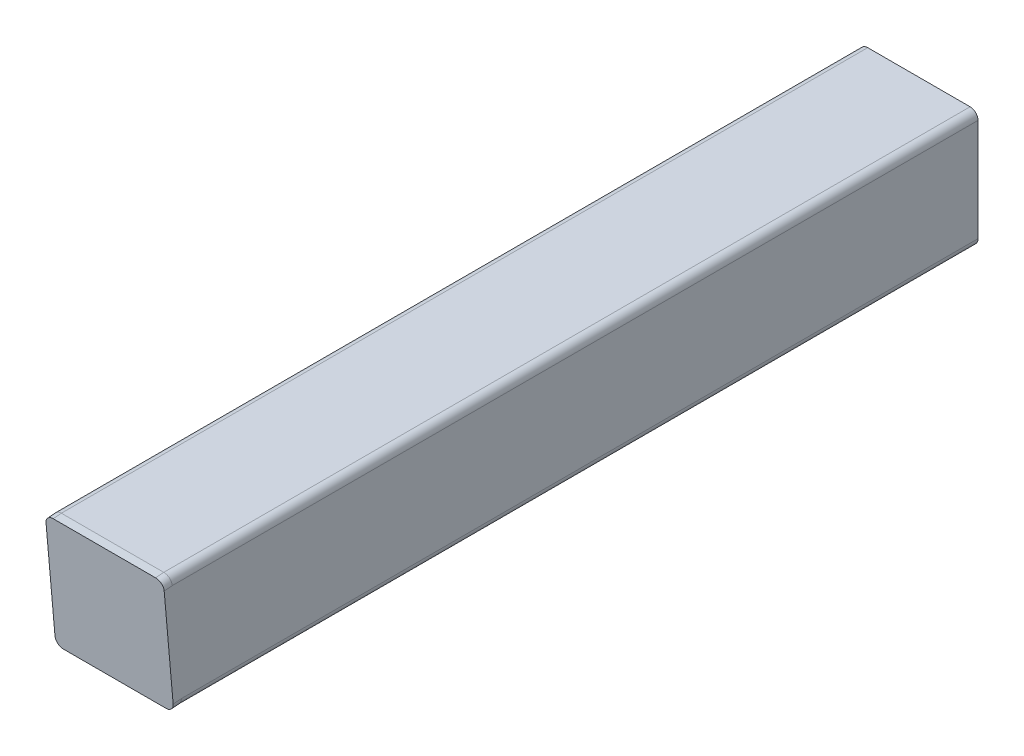
ISO-10303-21;
HEADER;
FILE_DESCRIPTION(('STEP AP214'),'2;1');
FILE_NAME('part.step','',(''),(''),'','','');
FILE_SCHEMA(('AUTOMOTIVE_DESIGN { 1 0 10303 214 1 1 1 1 }'));
ENDSEC;
DATA;
#1=APPLICATION_CONTEXT('core data for automotive mechanical design processes');
#2=APPLICATION_PROTOCOL_DEFINITION('international standard','automotive_design',2000,#1);
#3=PRODUCT_CONTEXT('',#1,'mechanical');
#4=PRODUCT('Part','Part','',(#3));
#5=PRODUCT_RELATED_PRODUCT_CATEGORY('part','',(#4));
#6=PRODUCT_DEFINITION_FORMATION('','',#4);
#7=PRODUCT_DEFINITION_CONTEXT('part definition',#1,'design');
#8=PRODUCT_DEFINITION('design','',#6,#7);
#9=PRODUCT_DEFINITION_SHAPE('','',#8);
#10=(LENGTH_UNIT() NAMED_UNIT(*) SI_UNIT(.MILLI.,.METRE.));
#11=(NAMED_UNIT(*) PLANE_ANGLE_UNIT() SI_UNIT($,.RADIAN.));
#12=(NAMED_UNIT(*) SI_UNIT($,.STERADIAN.) SOLID_ANGLE_UNIT());
#13=UNCERTAINTY_MEASURE_WITH_UNIT(LENGTH_MEASURE(1.E-05),#10,'distance_accuracy_value','');
#14=(GEOMETRIC_REPRESENTATION_CONTEXT(3) GLOBAL_UNCERTAINTY_ASSIGNED_CONTEXT((#13)) GLOBAL_UNIT_ASSIGNED_CONTEXT((#10,
#11,#12)) REPRESENTATION_CONTEXT('',''));
#15=CARTESIAN_POINT('',(0.,0.,0.));
#16=DIRECTION('',(0.,0.,1.));
#17=DIRECTION('',(1.,0.,0.));
#18=AXIS2_PLACEMENT_3D('',#15,#16,#17);
#19=CARTESIAN_POINT('',(2.54,-35.56,0.));
#20=DIRECTION('',(0.,0.,1.));
#21=DIRECTION('',(1.,0.,0.));
#22=AXIS2_PLACEMENT_3D('',#19,#20,#21);
#23=PLANE('',#22);
#24=CARTESIAN_POINT('',(2.54,-35.56,0.));
#25=DIRECTION('',(0.,0.,1.));
#26=DIRECTION('',(1.,0.,0.));
#27=AXIS2_PLACEMENT_3D('',#24,#25,#26);
#28=CIRCLE('',#27,2.54);
#29=CARTESIAN_POINT('',(0.,-35.56,0.));
#30=VERTEX_POINT('',#29);
#31=CARTESIAN_POINT('',(2.54000000000002,-38.1,0.));
#32=VERTEX_POINT('',#31);
#33=EDGE_CURVE('E358',#30,#32,#28,.T.);
#34=ORIENTED_EDGE('',*,*,#33,.F.);
#35=DIRECTION('',(0.,-1.,0.));
#36=VECTOR('',#35,1.);
#37=CARTESIAN_POINT('',(0.,-2.54000000000002,0.));
#38=LINE('',#37,#36);
#39=CARTESIAN_POINT('',(0.,-2.54000000000002,0.));
#40=VERTEX_POINT('',#39);
#41=EDGE_CURVE('E342',#40,#30,#38,.T.);
#42=ORIENTED_EDGE('',*,*,#41,.F.);
#43=CARTESIAN_POINT('',(2.54,-2.54,0.));
#44=DIRECTION('',(0.,0.,1.));
#45=DIRECTION('',(-1.,0.,0.));
#46=AXIS2_PLACEMENT_3D('',#43,#44,#45);
#47=CIRCLE('',#46,2.54);
#48=CARTESIAN_POINT('',(2.54000000000002,0.,0.));
#49=VERTEX_POINT('',#48);
#50=EDGE_CURVE('E345',#49,#40,#47,.T.);
#51=ORIENTED_EDGE('',*,*,#50,.F.);
#52=DIRECTION('',(-1.,0.,0.));
#53=VECTOR('',#52,1.);
#54=CARTESIAN_POINT('',(2.54000000000002,0.,0.));
#55=LINE('',#54,#53);
#56=CARTESIAN_POINT('',(35.56,0.,0.));
#57=VERTEX_POINT('',#56);
#58=EDGE_CURVE('E348',#57,#49,#55,.T.);
#59=ORIENTED_EDGE('',*,*,#58,.F.);
#60=CARTESIAN_POINT('',(35.56,-2.54,0.));
#61=DIRECTION('',(0.,0.,1.));
#62=DIRECTION('',(1.,0.,0.));
#63=AXIS2_PLACEMENT_3D('',#60,#61,#62);
#64=CIRCLE('',#63,2.54);
#65=CARTESIAN_POINT('',(38.1,-2.54000000000002,0.));
#66=VERTEX_POINT('',#65);
#67=EDGE_CURVE('E350',#66,#57,#64,.T.);
#68=ORIENTED_EDGE('',*,*,#67,.F.);
#69=DIRECTION('',(0.,1.,0.));
#70=VECTOR('',#69,1.);
#71=CARTESIAN_POINT('',(38.1,-2.54000000000002,0.));
#72=LINE('',#71,#70);
#73=CARTESIAN_POINT('',(38.1,-35.56,0.));
#74=VERTEX_POINT('',#73);
#75=EDGE_CURVE('E352',#74,#66,#72,.T.);
#76=ORIENTED_EDGE('',*,*,#75,.F.);
#77=CARTESIAN_POINT('',(35.56,-35.56,0.));
#78=DIRECTION('',(0.,0.,1.));
#79=DIRECTION('',(-1.,0.,0.));
#80=AXIS2_PLACEMENT_3D('',#77,#78,#79);
#81=CIRCLE('',#80,2.54);
#82=CARTESIAN_POINT('',(35.56,-38.1,0.));
#83=VERTEX_POINT('',#82);
#84=EDGE_CURVE('E355',#83,#74,#81,.T.);
#85=ORIENTED_EDGE('',*,*,#84,.F.);
#86=DIRECTION('',(1.,0.,0.));
#87=VECTOR('',#86,1.);
#88=CARTESIAN_POINT('',(2.54000000000002,-38.1,0.));
#89=LINE('',#88,#87);
#90=EDGE_CURVE('E321',#32,#83,#89,.T.);
#91=ORIENTED_EDGE('',*,*,#90,.F.);
#92=EDGE_LOOP('',(#34,#42,#51,#59,#68,#76,#85,#91));
#93=FACE_BOUND('',#92,.T.);
#94=CARTESIAN_POINT('',(5.3086,-32.7914,0.));
#95=DIRECTION('',(0.,0.,1.));
#96=DIRECTION('',(1.,0.,0.));
#97=AXIS2_PLACEMENT_3D('',#94,#95,#96);
#98=CIRCLE('',#97,2.54);
#99=CARTESIAN_POINT('',(2.7686,-32.7914,0.));
#100=VERTEX_POINT('',#99);
#101=CARTESIAN_POINT('',(5.30860000000002,-35.3314,0.));
#102=VERTEX_POINT('',#101);
#103=EDGE_CURVE('E400',#100,#102,#98,.T.);
#104=ORIENTED_EDGE('',*,*,#103,.T.);
#105=DIRECTION('',(1.,0.,0.));
#106=VECTOR('',#105,1.);
#107=CARTESIAN_POINT('',(5.30860000000002,-35.3314,0.));
#108=LINE('',#107,#106);
#109=CARTESIAN_POINT('',(32.7914,-35.3314,0.));
#110=VERTEX_POINT('',#109);
#111=EDGE_CURVE('E397',#102,#110,#108,.T.);
#112=ORIENTED_EDGE('',*,*,#111,.T.);
#113=CARTESIAN_POINT('',(32.7914,-32.7914,0.));
#114=DIRECTION('',(0.,0.,1.));
#115=DIRECTION('',(1.,0.,0.));
#116=AXIS2_PLACEMENT_3D('',#113,#114,#115);
#117=CIRCLE('',#116,2.54);
#118=CARTESIAN_POINT('',(35.3314,-32.7914,0.));
#119=VERTEX_POINT('',#118);
#120=EDGE_CURVE('E394',#110,#119,#117,.T.);
#121=ORIENTED_EDGE('',*,*,#120,.T.);
#122=DIRECTION('',(0.,1.,0.));
#123=VECTOR('',#122,1.);
#124=CARTESIAN_POINT('',(35.3314,-5.30860000000002,0.));
#125=LINE('',#124,#123);
#126=CARTESIAN_POINT('',(35.3314,-5.30860000000002,0.));
#127=VERTEX_POINT('',#126);
#128=EDGE_CURVE('E391',#119,#127,#125,.T.);
#129=ORIENTED_EDGE('',*,*,#128,.T.);
#130=CARTESIAN_POINT('',(32.7914,-5.3086,0.));
#131=DIRECTION('',(0.,0.,1.));
#132=DIRECTION('',(1.,0.,0.));
#133=AXIS2_PLACEMENT_3D('',#130,#131,#132);
#134=CIRCLE('',#133,2.54);
#135=CARTESIAN_POINT('',(32.7914,-2.7686,0.));
#136=VERTEX_POINT('',#135);
#137=EDGE_CURVE('E388',#127,#136,#134,.T.);
#138=ORIENTED_EDGE('',*,*,#137,.T.);
#139=DIRECTION('',(-1.,0.,0.));
#140=VECTOR('',#139,1.);
#141=CARTESIAN_POINT('',(5.30860000000002,-2.7686,0.));
#142=LINE('',#141,#140);
#143=CARTESIAN_POINT('',(5.30860000000002,-2.7686,0.));
#144=VERTEX_POINT('',#143);
#145=EDGE_CURVE('E385',#136,#144,#142,.T.);
#146=ORIENTED_EDGE('',*,*,#145,.T.);
#147=CARTESIAN_POINT('',(5.3086,-5.3086,0.));
#148=DIRECTION('',(0.,0.,1.));
#149=DIRECTION('',(1.,0.,0.));
#150=AXIS2_PLACEMENT_3D('',#147,#148,#149);
#151=CIRCLE('',#150,2.54);
#152=CARTESIAN_POINT('',(2.7686,-5.30860000000002,0.));
#153=VERTEX_POINT('',#152);
#154=EDGE_CURVE('E382',#144,#153,#151,.T.);
#155=ORIENTED_EDGE('',*,*,#154,.T.);
#156=DIRECTION('',(0.,-1.,0.));
#157=VECTOR('',#156,1.);
#158=CARTESIAN_POINT('',(2.7686,-5.30860000000002,0.));
#159=LINE('',#158,#157);
#160=EDGE_CURVE('E379',#153,#100,#159,.T.);
#161=ORIENTED_EDGE('',*,*,#160,.T.);
#162=EDGE_LOOP('',(#104,#112,#121,#129,#138,#146,#155,#161));
#163=FACE_BOUND('',#162,.T.);
#164=ADVANCED_FACE('F33',(#93,#163),#23,.F.);
#165=CARTESIAN_POINT('',(2.54,-35.56,260.));
#166=DIRECTION('',(0.,0.,-1.));
#167=DIRECTION('',(-1.,0.,0.));
#168=AXIS2_PLACEMENT_3D('',#165,#166,#167);
#169=CYLINDRICAL_SURFACE('',#168,2.54);
#170=DIRECTION('',(0.,0.,-1.));
#171=VECTOR('',#170,1.);
#172=CARTESIAN_POINT('',(2.54000000000002,-38.1,260.));
#173=LINE('',#172,#171);
#174=CARTESIAN_POINT('',(2.54000000000002,-38.1,256.666681919662));
#175=VERTEX_POINT('',#174);
#176=EDGE_CURVE('E41',#175,#32,#173,.T.);
#177=ORIENTED_EDGE('',*,*,#176,.F.);
#178=CARTESIAN_POINT('',(2.54,-35.56,256.888903125018));
#179=DIRECTION('',(0.,0.0871557427476583,-0.996194698091746));
#180=DIRECTION('',(0.,-0.996194698091746,-0.0871557427476583));
#181=AXIS2_PLACEMENT_3D('',#178,#179,#180);
#182=ELLIPSE('',#181,2.5497023873601,2.54);
#183=CARTESIAN_POINT('',(0.,-35.56,256.888903125018));
#184=VERTEX_POINT('',#183);
#185=EDGE_CURVE('E403',#175,#184,#182,.T.);
#186=ORIENTED_EDGE('',*,*,#185,.T.);
#187=DIRECTION('',(0.,0.,-1.));
#188=VECTOR('',#187,1.);
#189=CARTESIAN_POINT('',(0.,-35.56,260.));
#190=LINE('',#189,#188);
#191=EDGE_CURVE('E339',#184,#30,#190,.T.);
#192=ORIENTED_EDGE('',*,*,#191,.T.);
#193=ORIENTED_EDGE('',*,*,#33,.T.);
#194=EDGE_LOOP('',(#177,#186,#192,#193));
#195=FACE_BOUND('',#194,.T.);
#196=ADVANCED_FACE('F35',(#195),#169,.T.);
#197=CARTESIAN_POINT('',(2.54000000000002,-38.1,260.));
#198=DIRECTION('',(0.,1.,0.));
#199=DIRECTION('',(0.,0.,1.));
#200=AXIS2_PLACEMENT_3D('',#197,#198,#199);
#201=PLANE('',#200);
#202=DIRECTION('',(0.,0.,-1.));
#203=VECTOR('',#202,1.);
#204=CARTESIAN_POINT('',(35.56,-38.1,260.));
#205=LINE('',#204,#203);
#206=CARTESIAN_POINT('',(35.56,-38.1,256.666681919662));
#207=VERTEX_POINT('',#206);
#208=EDGE_CURVE('E318',#207,#83,#205,.T.);
#209=ORIENTED_EDGE('',*,*,#208,.F.);
#210=DIRECTION('',(1.,0.,0.));
#211=VECTOR('',#210,1.);
#212=CARTESIAN_POINT('',(0.,-38.1,256.666681919662));
#213=LINE('',#212,#211);
#214=EDGE_CURVE('E189',#175,#207,#213,.T.);
#215=ORIENTED_EDGE('',*,*,#214,.F.);
#216=ORIENTED_EDGE('',*,*,#176,.T.);
#217=ORIENTED_EDGE('',*,*,#90,.T.);
#218=EDGE_LOOP('',(#209,#215,#216,#217));
#219=FACE_BOUND('',#218,.T.);
#220=ADVANCED_FACE('F307',(#219),#201,.F.);
#221=CARTESIAN_POINT('',(35.56,-35.56,260.));
#222=DIRECTION('',(0.,0.,-1.));
#223=DIRECTION('',(-1.,0.,0.));
#224=AXIS2_PLACEMENT_3D('',#221,#222,#223);
#225=CYLINDRICAL_SURFACE('',#224,2.54);
#226=DIRECTION('',(0.,0.,-1.));
#227=VECTOR('',#226,1.);
#228=CARTESIAN_POINT('',(38.1,-35.56,260.));
#229=LINE('',#228,#227);
#230=CARTESIAN_POINT('',(38.1,-35.56,256.888903125018));
#231=VERTEX_POINT('',#230);
#232=EDGE_CURVE('E325',#231,#74,#229,.T.);
#233=ORIENTED_EDGE('',*,*,#232,.F.);
#234=CARTESIAN_POINT('',(35.56,-35.56,256.888903125018));
#235=DIRECTION('',(0.,0.0871557427476583,-0.996194698091746));
#236=DIRECTION('',(0.,-0.996194698091746,-0.0871557427476583));
#237=AXIS2_PLACEMENT_3D('',#234,#235,#236);
#238=ELLIPSE('',#237,2.5497023873601,2.54);
#239=EDGE_CURVE('E406',#231,#207,#238,.T.);
#240=ORIENTED_EDGE('',*,*,#239,.T.);
#241=ORIENTED_EDGE('',*,*,#208,.T.);
#242=ORIENTED_EDGE('',*,*,#84,.T.);
#243=EDGE_LOOP('',(#233,#240,#241,#242));
#244=FACE_BOUND('',#243,.T.);
#245=ADVANCED_FACE('F304',(#244),#225,.T.);
#246=CARTESIAN_POINT('',(38.1,-2.54000000000002,260.));
#247=DIRECTION('',(-1.,0.,0.));
#248=DIRECTION('',(0.,-1.,0.));
#249=AXIS2_PLACEMENT_3D('',#246,#247,#248);
#250=PLANE('',#249);
#251=DIRECTION('',(0.,0.,-1.));
#252=VECTOR('',#251,1.);
#253=CARTESIAN_POINT('',(38.1,-2.54000000000002,260.));
#254=LINE('',#253,#252);
#255=CARTESIAN_POINT('',(38.1,-2.54,259.777778794644));
#256=VERTEX_POINT('',#255);
#257=EDGE_CURVE('E327',#256,#66,#254,.T.);
#258=ORIENTED_EDGE('',*,*,#257,.F.);
#259=DIRECTION('',(0.,0.0871557427476583,-0.996194698091746));
#260=VECTOR('',#259,1.);
#261=CARTESIAN_POINT('',(38.1,-7.47379308689876,316.171291828899));
#262=LINE('',#261,#260);
#263=CARTESIAN_POINT('',(38.1,-2.76873004272169,262.392175146166));
#264=VERTEX_POINT('',#263);
#265=EDGE_CURVE('E214',#264,#256,#262,.T.);
#266=ORIENTED_EDGE('',*,*,#265,.F.);
#267=DIRECTION('',(0.,0.996194698091746,0.0871557427476584));
#268=VECTOR('',#267,1.);
#269=CARTESIAN_POINT('',(38.1,-35.7887300427217,259.50329947654));
#270=LINE('',#269,#268);
#271=CARTESIAN_POINT('',(38.1,-35.7887300427217,259.50329947654));
#272=VERTEX_POINT('',#271);
#273=EDGE_CURVE('E198',#272,#264,#270,.T.);
#274=ORIENTED_EDGE('',*,*,#273,.F.);
#275=DIRECTION('',(0.,0.0871557427476583,-0.996194698091746));
#276=VECTOR('',#275,1.);
#277=CARTESIAN_POINT('',(38.1,-40.4937930868988,313.282416159273));
#278=LINE('',#277,#276);
#279=EDGE_CURVE('E212',#272,#231,#278,.T.);
#280=ORIENTED_EDGE('',*,*,#279,.T.);
#281=ORIENTED_EDGE('',*,*,#232,.T.);
#282=ORIENTED_EDGE('',*,*,#75,.T.);
#283=EDGE_LOOP('',(#258,#266,#274,#280,#281,#282));
#284=FACE_BOUND('',#283,.T.);
#285=ADVANCED_FACE('F300',(#284),#250,.F.);
#286=CARTESIAN_POINT('',(35.56,-2.54,260.));
#287=DIRECTION('',(0.,0.,-1.));
#288=DIRECTION('',(-1.,0.,0.));
#289=AXIS2_PLACEMENT_3D('',#286,#287,#288);
#290=CYLINDRICAL_SURFACE('',#289,2.54);
#291=DIRECTION('',(0.,0.,-1.));
#292=VECTOR('',#291,1.);
#293=CARTESIAN_POINT('',(35.56,0.,260.));
#294=LINE('',#293,#292);
#295=CARTESIAN_POINT('',(35.56,0.,260.));
#296=VERTEX_POINT('',#295);
#297=EDGE_CURVE('E331',#296,#57,#294,.T.);
#298=ORIENTED_EDGE('',*,*,#297,.F.);
#299=CARTESIAN_POINT('',(35.56,-2.54,259.777778794644));
#300=DIRECTION('',(0.,0.0871557427476583,-0.996194698091746));
#301=DIRECTION('',(0.,-0.996194698091746,-0.0871557427476583));
#302=AXIS2_PLACEMENT_3D('',#299,#300,#301);
#303=ELLIPSE('',#302,2.5497023873601,2.54);
#304=EDGE_CURVE('E408',#296,#256,#303,.T.);
#305=ORIENTED_EDGE('',*,*,#304,.T.);
#306=ORIENTED_EDGE('',*,*,#257,.T.);
#307=ORIENTED_EDGE('',*,*,#67,.T.);
#308=EDGE_LOOP('',(#298,#305,#306,#307));
#309=FACE_BOUND('',#308,.T.);
#310=ADVANCED_FACE('F296',(#309),#290,.T.);
#311=CARTESIAN_POINT('',(2.54000000000002,0.,260.));
#312=DIRECTION('',(0.,-1.,0.));
#313=DIRECTION('',(0.,0.,-1.));
#314=AXIS2_PLACEMENT_3D('',#311,#312,#313);
#315=PLANE('',#314);
#316=ORIENTED_EDGE('',*,*,#58,.T.);
#317=DIRECTION('',(0.,0.,-1.));
#318=VECTOR('',#317,1.);
#319=CARTESIAN_POINT('',(2.54000000000002,0.,260.));
#320=LINE('',#319,#318);
#321=CARTESIAN_POINT('',(2.54,0.,260.));
#322=VERTEX_POINT('',#321);
#323=EDGE_CURVE('E334',#322,#49,#320,.T.);
#324=ORIENTED_EDGE('',*,*,#323,.F.);
#325=DIRECTION('',(-1.,0.,0.));
#326=VECTOR('',#325,1.);
#327=CARTESIAN_POINT('',(2.54000000000002,0.,260.));
#328=LINE('',#327,#326);
#329=EDGE_CURVE('E341',#296,#322,#328,.T.);
#330=ORIENTED_EDGE('',*,*,#329,.F.);
#331=ORIENTED_EDGE('',*,*,#297,.T.);
#332=EDGE_LOOP('',(#316,#324,#330,#331));
#333=FACE_BOUND('',#332,.T.);
#334=ADVANCED_FACE('F292',(#333),#315,.F.);
#335=CARTESIAN_POINT('',(2.54,-2.54,260.));
#336=DIRECTION('',(0.,0.,-1.));
#337=DIRECTION('',(-1.,0.,0.));
#338=AXIS2_PLACEMENT_3D('',#335,#336,#337);
#339=CYLINDRICAL_SURFACE('',#338,2.54);
#340=DIRECTION('',(0.,0.,-1.));
#341=VECTOR('',#340,1.);
#342=CARTESIAN_POINT('',(0.,-2.54000000000002,260.));
#343=LINE('',#342,#341);
#344=CARTESIAN_POINT('',(0.,-2.54000000000002,259.777778794644));
#345=VERTEX_POINT('',#344);
#346=EDGE_CURVE('E337',#345,#40,#343,.T.);
#347=ORIENTED_EDGE('',*,*,#346,.F.);
#348=CARTESIAN_POINT('',(2.54,-2.54,259.777778794644));
#349=DIRECTION('',(0.,0.0871557427476583,-0.996194698091746));
#350=DIRECTION('',(0.,-0.996194698091746,-0.0871557427476583));
#351=AXIS2_PLACEMENT_3D('',#348,#349,#350);
#352=ELLIPSE('',#351,2.5497023873601,2.54);
#353=EDGE_CURVE('E48',#345,#322,#352,.T.);
#354=ORIENTED_EDGE('',*,*,#353,.T.);
#355=ORIENTED_EDGE('',*,*,#323,.T.);
#356=ORIENTED_EDGE('',*,*,#50,.T.);
#357=EDGE_LOOP('',(#347,#354,#355,#356));
#358=FACE_BOUND('',#357,.T.);
#359=ADVANCED_FACE('F289',(#358),#339,.T.);
#360=CARTESIAN_POINT('',(0.,-2.54000000000002,260.));
#361=DIRECTION('',(1.,0.,0.));
#362=DIRECTION('',(0.,1.,0.));
#363=AXIS2_PLACEMENT_3D('',#360,#361,#362);
#364=PLANE('',#363);
#365=ORIENTED_EDGE('',*,*,#191,.F.);
#366=DIRECTION('',(0.,0.0871557427476583,-0.996194698091746));
#367=VECTOR('',#366,1.);
#368=CARTESIAN_POINT('',(0.,-40.4937930868988,313.282416159273));
#369=LINE('',#368,#367);
#370=CARTESIAN_POINT('',(0.,-35.7887300427217,259.50329947654));
#371=VERTEX_POINT('',#370);
#372=EDGE_CURVE('E179',#371,#184,#369,.T.);
#373=ORIENTED_EDGE('',*,*,#372,.F.);
#374=DIRECTION('',(0.,-0.996194698091746,-0.0871557427476584));
#375=VECTOR('',#374,1.);
#376=CARTESIAN_POINT('',(0.,-2.76873004272172,262.392175146166));
#377=LINE('',#376,#375);
#378=CARTESIAN_POINT('',(0.,-2.76873004272172,262.392175146166));
#379=VERTEX_POINT('',#378);
#380=EDGE_CURVE('E173',#379,#371,#377,.T.);
#381=ORIENTED_EDGE('',*,*,#380,.F.);
#382=DIRECTION('',(0.,0.0871557427476583,-0.996194698091746));
#383=VECTOR('',#382,1.);
#384=CARTESIAN_POINT('',(0.,-7.47379308689877,316.171291828899));
#385=LINE('',#384,#383);
#386=EDGE_CURVE('E165',#379,#345,#385,.T.);
#387=ORIENTED_EDGE('',*,*,#386,.T.);
#388=ORIENTED_EDGE('',*,*,#346,.T.);
#389=ORIENTED_EDGE('',*,*,#41,.T.);
#390=EDGE_LOOP('',(#365,#373,#381,#387,#388,#389));
#391=FACE_BOUND('',#390,.T.);
#392=ADVANCED_FACE('F178',(#391),#364,.F.);
#393=CARTESIAN_POINT('',(5.3086,-32.7914,260.));
#394=DIRECTION('',(0.,0.,-1.));
#395=DIRECTION('',(-1.,0.,0.));
#396=AXIS2_PLACEMENT_3D('',#393,#394,#395);
#397=CYLINDRICAL_SURFACE('',#396,2.54);
#398=CARTESIAN_POINT('',(5.3086,-32.7914,257.131124238856));
#399=DIRECTION('',(0.,0.0871557427476583,-0.996194698091746));
#400=DIRECTION('',(0.,-0.996194698091746,-0.0871557427476583));
#401=AXIS2_PLACEMENT_3D('',#398,#399,#400);
#402=ELLIPSE('',#401,2.5497023873601,2.54);
#403=CARTESIAN_POINT('',(5.30860000000002,-35.3314,256.9089030335));
#404=VERTEX_POINT('',#403);
#405=CARTESIAN_POINT('',(2.7686,-32.7914,257.131124238856));
#406=VERTEX_POINT('',#405);
#407=EDGE_CURVE('E412',#404,#406,#402,.T.);
#408=ORIENTED_EDGE('',*,*,#407,.F.);
#409=DIRECTION('',(0.,0.,-1.));
#410=VECTOR('',#409,1.);
#411=CARTESIAN_POINT('',(5.30860000000002,-35.3314,260.));
#412=LINE('',#411,#410);
#413=EDGE_CURVE('E361',#404,#102,#412,.T.);
#414=ORIENTED_EDGE('',*,*,#413,.T.);
#415=ORIENTED_EDGE('',*,*,#103,.F.);
#416=DIRECTION('',(0.,0.,-1.));
#417=VECTOR('',#416,1.);
#418=CARTESIAN_POINT('',(2.7686,-32.7914,260.));
#419=LINE('',#418,#417);
#420=EDGE_CURVE('E377',#406,#100,#419,.T.);
#421=ORIENTED_EDGE('',*,*,#420,.F.);
#422=EDGE_LOOP('',(#408,#414,#415,#421));
#423=FACE_BOUND('',#422,.T.);
#424=ADVANCED_FACE('F279',(#423),#397,.F.);
#425=CARTESIAN_POINT('',(5.30860000000002,-35.3314,260.));
#426=DIRECTION('',(0.,1.,0.));
#427=DIRECTION('',(0.,0.,1.));
#428=AXIS2_PLACEMENT_3D('',#425,#426,#427);
#429=PLANE('',#428);
#430=DIRECTION('',(-1.,0.,0.));
#431=VECTOR('',#430,1.);
#432=CARTESIAN_POINT('',(5.30860000000002,-35.3314,256.9089030335));
#433=LINE('',#432,#431);
#434=CARTESIAN_POINT('',(32.7914,-35.3314,256.9089030335));
#435=VERTEX_POINT('',#434);
#436=EDGE_CURVE('E415',#435,#404,#433,.T.);
#437=ORIENTED_EDGE('',*,*,#436,.F.);
#438=DIRECTION('',(0.,0.,-1.));
#439=VECTOR('',#438,1.);
#440=CARTESIAN_POINT('',(32.7914,-35.3314,260.));
#441=LINE('',#440,#439);
#442=EDGE_CURVE('E365',#435,#110,#441,.T.);
#443=ORIENTED_EDGE('',*,*,#442,.T.);
#444=ORIENTED_EDGE('',*,*,#111,.F.);
#445=ORIENTED_EDGE('',*,*,#413,.F.);
#446=EDGE_LOOP('',(#437,#443,#444,#445));
#447=FACE_BOUND('',#446,.T.);
#448=ADVANCED_FACE('F275',(#447),#429,.T.);
#449=CARTESIAN_POINT('',(32.7914,-32.7914,260.));
#450=DIRECTION('',(0.,0.,-1.));
#451=DIRECTION('',(-1.,0.,0.));
#452=AXIS2_PLACEMENT_3D('',#449,#450,#451);
#453=CYLINDRICAL_SURFACE('',#452,2.54);
#454=CARTESIAN_POINT('',(32.7914,-32.7914,257.131124238856));
#455=DIRECTION('',(0.,0.0871557427476583,-0.996194698091746));
#456=DIRECTION('',(0.,-0.996194698091746,-0.0871557427476583));
#457=AXIS2_PLACEMENT_3D('',#454,#455,#456);
#458=ELLIPSE('',#457,2.5497023873601,2.54);
#459=CARTESIAN_POINT('',(35.3314,-32.7914,257.131124238856));
#460=VERTEX_POINT('',#459);
#461=EDGE_CURVE('E418',#460,#435,#458,.T.);
#462=ORIENTED_EDGE('',*,*,#461,.F.);
#463=DIRECTION('',(0.,0.,-1.));
#464=VECTOR('',#463,1.);
#465=CARTESIAN_POINT('',(35.3314,-32.7914,260.));
#466=LINE('',#465,#464);
#467=EDGE_CURVE('E367',#460,#119,#466,.T.);
#468=ORIENTED_EDGE('',*,*,#467,.T.);
#469=ORIENTED_EDGE('',*,*,#120,.F.);
#470=ORIENTED_EDGE('',*,*,#442,.F.);
#471=EDGE_LOOP('',(#462,#468,#469,#470));
#472=FACE_BOUND('',#471,.T.);
#473=ADVANCED_FACE('F271',(#472),#453,.F.);
#474=CARTESIAN_POINT('',(35.3314,-5.30860000000002,260.));
#475=DIRECTION('',(-1.,0.,0.));
#476=DIRECTION('',(0.,0.,1.));
#477=AXIS2_PLACEMENT_3D('',#474,#475,#476);
#478=PLANE('',#477);
#479=DIRECTION('',(0.,-0.996194698091746,-0.0871557427476583));
#480=VECTOR('',#479,1.);
#481=CARTESIAN_POINT('',(35.3314,-5.26827521882032,259.539085642019));
#482=LINE('',#481,#480);
#483=CARTESIAN_POINT('',(35.3314,-5.30860000000002,259.535557680806));
#484=VERTEX_POINT('',#483);
#485=EDGE_CURVE('E421',#484,#460,#482,.T.);
#486=ORIENTED_EDGE('',*,*,#485,.F.);
#487=DIRECTION('',(0.,0.,-1.));
#488=VECTOR('',#487,1.);
#489=CARTESIAN_POINT('',(35.3314,-5.30860000000002,260.));
#490=LINE('',#489,#488);
#491=EDGE_CURVE('E369',#484,#127,#490,.T.);
#492=ORIENTED_EDGE('',*,*,#491,.T.);
#493=ORIENTED_EDGE('',*,*,#128,.F.);
#494=ORIENTED_EDGE('',*,*,#467,.F.);
#495=EDGE_LOOP('',(#486,#492,#493,#494));
#496=FACE_BOUND('',#495,.T.);
#497=ADVANCED_FACE('F267',(#496),#478,.T.);
#498=CARTESIAN_POINT('',(32.7914,-5.3086,260.));
#499=DIRECTION('',(0.,0.,-1.));
#500=DIRECTION('',(-1.,0.,0.));
#501=AXIS2_PLACEMENT_3D('',#498,#499,#500);
#502=CYLINDRICAL_SURFACE('',#501,2.54);
#503=CARTESIAN_POINT('',(32.7914,-5.3086,259.535557680806));
#504=DIRECTION('',(0.,0.0871557427476583,-0.996194698091746));
#505=DIRECTION('',(0.,-0.996194698091746,-0.0871557427476583));
#506=AXIS2_PLACEMENT_3D('',#503,#504,#505);
#507=ELLIPSE('',#506,2.5497023873601,2.54);
#508=CARTESIAN_POINT('',(32.7914,-2.7686,259.757778886162));
#509=VERTEX_POINT('',#508);
#510=EDGE_CURVE('E424',#509,#484,#507,.T.);
#511=ORIENTED_EDGE('',*,*,#510,.F.);
#512=DIRECTION('',(0.,0.,-1.));
#513=VECTOR('',#512,1.);
#514=CARTESIAN_POINT('',(32.7914,-2.7686,260.));
#515=LINE('',#514,#513);
#516=EDGE_CURVE('E371',#509,#136,#515,.T.);
#517=ORIENTED_EDGE('',*,*,#516,.T.);
#518=ORIENTED_EDGE('',*,*,#137,.F.);
#519=ORIENTED_EDGE('',*,*,#491,.F.);
#520=EDGE_LOOP('',(#511,#517,#518,#519));
#521=FACE_BOUND('',#520,.T.);
#522=ADVANCED_FACE('F263',(#521),#502,.F.);
#523=CARTESIAN_POINT('',(5.30860000000002,-2.7686,260.));
#524=DIRECTION('',(0.,-1.,0.));
#525=DIRECTION('',(0.,0.,-1.));
#526=AXIS2_PLACEMENT_3D('',#523,#524,#525);
#527=PLANE('',#526);
#528=DIRECTION('',(1.,0.,0.));
#529=VECTOR('',#528,1.);
#530=CARTESIAN_POINT('',(5.30860000000002,-2.7686,259.757778886162));
#531=LINE('',#530,#529);
#532=CARTESIAN_POINT('',(5.30860000000002,-2.7686,259.757778886162));
#533=VERTEX_POINT('',#532);
#534=EDGE_CURVE('E427',#533,#509,#531,.T.);
#535=ORIENTED_EDGE('',*,*,#534,.F.);
#536=DIRECTION('',(0.,0.,-1.));
#537=VECTOR('',#536,1.);
#538=CARTESIAN_POINT('',(5.30860000000002,-2.7686,260.));
#539=LINE('',#538,#537);
#540=EDGE_CURVE('E373',#533,#144,#539,.T.);
#541=ORIENTED_EDGE('',*,*,#540,.T.);
#542=ORIENTED_EDGE('',*,*,#145,.F.);
#543=ORIENTED_EDGE('',*,*,#516,.F.);
#544=EDGE_LOOP('',(#535,#541,#542,#543));
#545=FACE_BOUND('',#544,.T.);
#546=ADVANCED_FACE('F259',(#545),#527,.T.);
#547=CARTESIAN_POINT('',(5.3086,-5.3086,260.));
#548=DIRECTION('',(0.,0.,-1.));
#549=DIRECTION('',(-1.,0.,0.));
#550=AXIS2_PLACEMENT_3D('',#547,#548,#549);
#551=CYLINDRICAL_SURFACE('',#550,2.54);
#552=CARTESIAN_POINT('',(5.3086,-5.3086,259.535557680806));
#553=DIRECTION('',(0.,0.0871557427476583,-0.996194698091746));
#554=DIRECTION('',(0.,-0.996194698091746,-0.0871557427476583));
#555=AXIS2_PLACEMENT_3D('',#552,#553,#554);
#556=ELLIPSE('',#555,2.5497023873601,2.54);
#557=CARTESIAN_POINT('',(2.7686,-5.30860000000002,259.535557680806));
#558=VERTEX_POINT('',#557);
#559=EDGE_CURVE('E192',#558,#533,#556,.T.);
#560=ORIENTED_EDGE('',*,*,#559,.F.);
#561=DIRECTION('',(0.,0.,-1.));
#562=VECTOR('',#561,1.);
#563=CARTESIAN_POINT('',(2.7686,-5.30860000000002,260.));
#564=LINE('',#563,#562);
#565=EDGE_CURVE('E375',#558,#153,#564,.T.);
#566=ORIENTED_EDGE('',*,*,#565,.T.);
#567=ORIENTED_EDGE('',*,*,#154,.F.);
#568=ORIENTED_EDGE('',*,*,#540,.F.);
#569=EDGE_LOOP('',(#560,#566,#567,#568));
#570=FACE_BOUND('',#569,.T.);
#571=ADVANCED_FACE('F256',(#570),#551,.F.);
#572=CARTESIAN_POINT('',(2.7686,-5.30860000000002,260.));
#573=DIRECTION('',(1.,0.,0.));
#574=DIRECTION('',(0.,0.,-1.));
#575=AXIS2_PLACEMENT_3D('',#572,#573,#574);
#576=PLANE('',#575);
#577=DIRECTION('',(0.,0.996194698091746,0.0871557427476583));
#578=VECTOR('',#577,1.);
#579=CARTESIAN_POINT('',(2.7686,-5.26827521882032,259.539085642019));
#580=LINE('',#579,#578);
#581=EDGE_CURVE('E11',#406,#558,#580,.T.);
#582=ORIENTED_EDGE('',*,*,#581,.F.);
#583=ORIENTED_EDGE('',*,*,#420,.T.);
#584=ORIENTED_EDGE('',*,*,#160,.F.);
#585=ORIENTED_EDGE('',*,*,#565,.F.);
#586=EDGE_LOOP('',(#582,#583,#584,#585));
#587=FACE_BOUND('',#586,.T.);
#588=ADVANCED_FACE('F253',(#587),#576,.T.);
#589=CARTESIAN_POINT('',(2.53999999994672,-3435.75285666004,-37.9550179972954));
#590=DIRECTION('',(0.,-0.0871557427476584,0.996194698091746));
#591=DIRECTION('',(0.,-0.996194698091746,-0.0871557427476584));
#592=AXIS2_PLACEMENT_3D('',#589,#590,#591);
#593=PLANE('',#592);
#594=ORIENTED_EDGE('',*,*,#380,.T.);
#595=CARTESIAN_POINT('',(2.54,-35.7887300427217,259.50329947654));
#596=DIRECTION('',(0.,-0.0871557427476583,0.996194698091746));
#597=DIRECTION('',(0.,-0.996194698091746,-0.0871557427476583));
#598=AXIS2_PLACEMENT_3D('',#595,#596,#597);
#599=ELLIPSE('',#598,2.5497023873601,2.54);
#600=CARTESIAN_POINT('',(2.54000000000002,-38.3287300427217,259.281078271184));
#601=VERTEX_POINT('',#600);
#602=EDGE_CURVE('E183',#371,#601,#599,.T.);
#603=ORIENTED_EDGE('',*,*,#602,.T.);
#604=DIRECTION('',(1.,0.,0.));
#605=VECTOR('',#604,1.);
#606=CARTESIAN_POINT('',(2.54000000000001,-38.3287300427217,259.281078271184));
#607=LINE('',#606,#605);
#608=CARTESIAN_POINT('',(35.56,-38.3287300427217,259.281078271184));
#609=VERTEX_POINT('',#608);
#610=EDGE_CURVE('E204',#601,#609,#607,.T.);
#611=ORIENTED_EDGE('',*,*,#610,.T.);
#612=CARTESIAN_POINT('',(35.56,-35.7887300427217,259.50329947654));
#613=DIRECTION('',(0.,-0.0871557427476583,0.996194698091746));
#614=DIRECTION('',(0.,-0.996194698091746,-0.0871557427476583));
#615=AXIS2_PLACEMENT_3D('',#612,#613,#614);
#616=ELLIPSE('',#615,2.5497023873601,2.54);
#617=EDGE_CURVE('E201',#609,#272,#616,.T.);
#618=ORIENTED_EDGE('',*,*,#617,.T.);
#619=ORIENTED_EDGE('',*,*,#273,.T.);
#620=CARTESIAN_POINT('',(35.56,-2.76873004272169,262.392175146166));
#621=DIRECTION('',(0.,-0.0871557427476583,0.996194698091746));
#622=DIRECTION('',(0.,-0.996194698091746,-0.0871557427476583));
#623=AXIS2_PLACEMENT_3D('',#620,#621,#622);
#624=ELLIPSE('',#623,2.5497023873601,2.54);
#625=CARTESIAN_POINT('',(35.56,-0.228730042721696,262.614396351522));
#626=VERTEX_POINT('',#625);
#627=EDGE_CURVE('E194',#264,#626,#624,.T.);
#628=ORIENTED_EDGE('',*,*,#627,.T.);
#629=DIRECTION('',(-1.,0.,0.));
#630=VECTOR('',#629,1.);
#631=CARTESIAN_POINT('',(35.56,-0.228730042721698,262.614396351522));
#632=LINE('',#631,#630);
#633=CARTESIAN_POINT('',(2.54,-0.228730042721691,262.614396351522));
#634=VERTEX_POINT('',#633);
#635=EDGE_CURVE('E188',#626,#634,#632,.T.);
#636=ORIENTED_EDGE('',*,*,#635,.T.);
#637=CARTESIAN_POINT('',(2.54,-2.76873004272169,262.392175146166));
#638=DIRECTION('',(0.,-0.0871557427476583,0.996194698091746));
#639=DIRECTION('',(0.,-0.996194698091746,-0.0871557427476583));
#640=AXIS2_PLACEMENT_3D('',#637,#638,#639);
#641=ELLIPSE('',#640,2.5497023873601,2.54);
#642=EDGE_CURVE('E169',#634,#379,#641,.T.);
#643=ORIENTED_EDGE('',*,*,#642,.T.);
#644=EDGE_LOOP('',(#594,#603,#611,#618,#619,#628,#636,#643));
#645=FACE_BOUND('',#644,.T.);
#646=ADVANCED_FACE('F186',(#645),#593,.T.);
#647=CARTESIAN_POINT('',(2.54,-7.47379308689876,316.171291828899));
#648=DIRECTION('',(0.,-0.0871557427476583,0.996194698091746));
#649=DIRECTION('',(0.,-0.996194698091746,-0.0871557427476583));
#650=AXIS2_PLACEMENT_3D('',#647,#648,#649);
#651=ELLIPSE('',#650,2.5497023873601,2.54);
#652=DIRECTION('',(0.,0.0871557427476583,-0.996194698091746));
#653=VECTOR('',#652,1.);
#654=SURFACE_OF_LINEAR_EXTRUSION('',#651,#653);
#655=ORIENTED_EDGE('',*,*,#642,.F.);
#656=DIRECTION('',(0.,0.0871557427476583,-0.996194698091746));
#657=VECTOR('',#656,1.);
#658=CARTESIAN_POINT('',(2.54,-4.93379308689876,316.393513034255));
#659=LINE('',#658,#657);
#660=EDGE_CURVE('E174',#634,#322,#659,.T.);
#661=ORIENTED_EDGE('',*,*,#660,.T.);
#662=ORIENTED_EDGE('',*,*,#353,.F.);
#663=ORIENTED_EDGE('',*,*,#386,.F.);
#664=EDGE_LOOP('',(#655,#661,#662,#663));
#665=FACE_BOUND('',#664,.T.);
#666=ADVANCED_FACE('F167',(#665),#654,.F.);
#667=CARTESIAN_POINT('',(35.56,-4.93379308689876,316.393513034255));
#668=DIRECTION('',(0.,-0.996194698091746,-0.0871557427476583));
#669=DIRECTION('',(0.,0.0871557427476583,-0.996194698091746));
#670=AXIS2_PLACEMENT_3D('',#667,#668,#669);
#671=PLANE('',#670);
#672=ORIENTED_EDGE('',*,*,#635,.F.);
#673=DIRECTION('',(0.,0.0871557427476583,-0.996194698091746));
#674=VECTOR('',#673,1.);
#675=CARTESIAN_POINT('',(35.56,-4.93379308689876,316.393513034255));
#676=LINE('',#675,#674);
#677=EDGE_CURVE('E216',#626,#296,#676,.T.);
#678=ORIENTED_EDGE('',*,*,#677,.T.);
#679=ORIENTED_EDGE('',*,*,#329,.T.);
#680=ORIENTED_EDGE('',*,*,#660,.F.);
#681=EDGE_LOOP('',(#672,#678,#679,#680));
#682=FACE_BOUND('',#681,.T.);
#683=ADVANCED_FACE('F228',(#682),#671,.F.);
#684=CARTESIAN_POINT('',(35.56,-7.47379308689876,316.171291828899));
#685=DIRECTION('',(0.,-0.0871557427476583,0.996194698091746));
#686=DIRECTION('',(0.,-0.996194698091746,-0.0871557427476583));
#687=AXIS2_PLACEMENT_3D('',#684,#685,#686);
#688=ELLIPSE('',#687,2.5497023873601,2.54);
#689=DIRECTION('',(0.,0.0871557427476583,-0.996194698091746));
#690=VECTOR('',#689,1.);
#691=SURFACE_OF_LINEAR_EXTRUSION('',#688,#690);
#692=ORIENTED_EDGE('',*,*,#627,.F.);
#693=ORIENTED_EDGE('',*,*,#265,.T.);
#694=ORIENTED_EDGE('',*,*,#304,.F.);
#695=ORIENTED_EDGE('',*,*,#677,.F.);
#696=EDGE_LOOP('',(#692,#693,#694,#695));
#697=FACE_BOUND('',#696,.T.);
#698=ADVANCED_FACE('F232',(#697),#691,.F.);
#699=CARTESIAN_POINT('',(35.56,-40.4937930868988,313.282416159273));
#700=DIRECTION('',(0.,-0.0871557427476583,0.996194698091746));
#701=DIRECTION('',(0.,-0.996194698091746,-0.0871557427476583));
#702=AXIS2_PLACEMENT_3D('',#699,#700,#701);
#703=ELLIPSE('',#702,2.5497023873601,2.54);
#704=DIRECTION('',(0.,0.0871557427476583,-0.996194698091746));
#705=VECTOR('',#704,1.);
#706=SURFACE_OF_LINEAR_EXTRUSION('',#703,#705);
#707=ORIENTED_EDGE('',*,*,#617,.F.);
#708=DIRECTION('',(0.,0.0871557427476583,-0.996194698091746));
#709=VECTOR('',#708,1.);
#710=CARTESIAN_POINT('',(35.56,-43.0337930868988,313.060194953917));
#711=LINE('',#710,#709);
#712=EDGE_CURVE('E210',#609,#207,#711,.T.);
#713=ORIENTED_EDGE('',*,*,#712,.T.);
#714=ORIENTED_EDGE('',*,*,#239,.F.);
#715=ORIENTED_EDGE('',*,*,#279,.F.);
#716=EDGE_LOOP('',(#707,#713,#714,#715));
#717=FACE_BOUND('',#716,.T.);
#718=ADVANCED_FACE('F236',(#717),#706,.F.);
#719=CARTESIAN_POINT('',(2.54000000000002,-43.0337930868988,313.060194953917));
#720=DIRECTION('',(0.,0.996194698091746,0.0871557427476583));
#721=DIRECTION('',(0.,-0.0871557427476583,0.996194698091746));
#722=AXIS2_PLACEMENT_3D('',#719,#720,#721);
#723=PLANE('',#722);
#724=ORIENTED_EDGE('',*,*,#610,.F.);
#725=DIRECTION('',(0.,0.0871557427476583,-0.996194698091746));
#726=VECTOR('',#725,1.);
#727=CARTESIAN_POINT('',(2.54000000000002,-43.0337930868988,313.060194953917));
#728=LINE('',#727,#726);
#729=EDGE_CURVE('E208',#601,#175,#728,.T.);
#730=ORIENTED_EDGE('',*,*,#729,.T.);
#731=ORIENTED_EDGE('',*,*,#214,.T.);
#732=ORIENTED_EDGE('',*,*,#712,.F.);
#733=EDGE_LOOP('',(#724,#730,#731,#732));
#734=FACE_BOUND('',#733,.T.);
#735=ADVANCED_FACE('F240',(#734),#723,.F.);
#736=CARTESIAN_POINT('',(2.54000000000001,-40.4937930868988,313.282416159273));
#737=DIRECTION('',(0.,-0.0871557427476583,0.996194698091746));
#738=DIRECTION('',(0.,-0.996194698091746,-0.0871557427476583));
#739=AXIS2_PLACEMENT_3D('',#736,#737,#738);
#740=ELLIPSE('',#739,2.5497023873601,2.54);
#741=DIRECTION('',(0.,0.0871557427476583,-0.996194698091746));
#742=VECTOR('',#741,1.);
#743=SURFACE_OF_LINEAR_EXTRUSION('',#740,#742);
#744=ORIENTED_EDGE('',*,*,#602,.F.);
#745=ORIENTED_EDGE('',*,*,#372,.T.);
#746=ORIENTED_EDGE('',*,*,#185,.F.);
#747=ORIENTED_EDGE('',*,*,#729,.F.);
#748=EDGE_LOOP('',(#744,#745,#746,#747));
#749=FACE_BOUND('',#748,.T.);
#750=ADVANCED_FACE('F247',(#749),#743,.F.);
#751=CARTESIAN_POINT('',(2.54,-35.56,256.888903125018));
#752=DIRECTION('',(0.,-0.0871557427476583,0.996194698091746));
#753=DIRECTION('',(0.,-0.996194698091746,-0.0871557427476583));
#754=AXIS2_PLACEMENT_3D('',#751,#752,#753);
#755=PLANE('',#754);
#756=ORIENTED_EDGE('',*,*,#407,.T.);
#757=ORIENTED_EDGE('',*,*,#581,.T.);
#758=ORIENTED_EDGE('',*,*,#559,.T.);
#759=ORIENTED_EDGE('',*,*,#534,.T.);
#760=ORIENTED_EDGE('',*,*,#510,.T.);
#761=ORIENTED_EDGE('',*,*,#485,.T.);
#762=ORIENTED_EDGE('',*,*,#461,.T.);
#763=ORIENTED_EDGE('',*,*,#436,.T.);
#764=EDGE_LOOP('',(#756,#757,#758,#759,#760,#761,#762,#763));
#765=FACE_BOUND('',#764,.T.);
#766=ADVANCED_FACE('F229',(#765),#755,.F.);
#767=CLOSED_SHELL('',(#164,#196,#220,#245,#285,#310,#334,#359,#392,#424,#448,#473,#497,#522,
#546,#571,#588,#646,#666,#683,#698,#718,#735,#750,#766));
#768=MANIFOLD_SOLID_BREP('B2',#767);
#769=ADVANCED_BREP_SHAPE_REPRESENTATION('',(#18,#768),#14);
#770=SHAPE_DEFINITION_REPRESENTATION(#9,#769);
ENDSEC;
END-ISO-10303-21;
